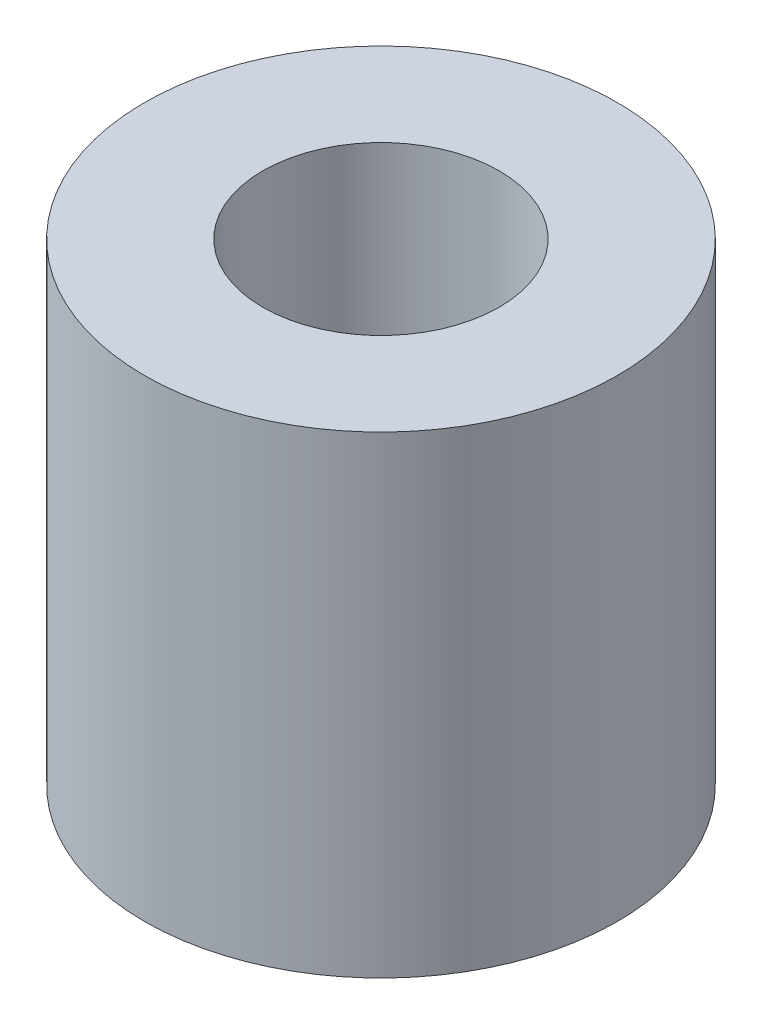
ISO-10303-21;
HEADER;
FILE_DESCRIPTION(('STEP AP214'),'2;1');
FILE_NAME('part.step','',(''),(''),'','','');
FILE_SCHEMA(('AUTOMOTIVE_DESIGN { 1 0 10303 214 1 1 1 1 }'));
ENDSEC;
DATA;
#1=APPLICATION_CONTEXT('core data for automotive mechanical design processes');
#2=APPLICATION_PROTOCOL_DEFINITION('international standard','automotive_design',2000,#1);
#3=PRODUCT_CONTEXT('',#1,'mechanical');
#4=PRODUCT('Part','Part','',(#3));
#5=PRODUCT_RELATED_PRODUCT_CATEGORY('part','',(#4));
#6=PRODUCT_DEFINITION_FORMATION('','',#4);
#7=PRODUCT_DEFINITION_CONTEXT('part definition',#1,'design');
#8=PRODUCT_DEFINITION('design','',#6,#7);
#9=PRODUCT_DEFINITION_SHAPE('','',#8);
#10=(LENGTH_UNIT() NAMED_UNIT(*) SI_UNIT(.MILLI.,.METRE.));
#11=(NAMED_UNIT(*) PLANE_ANGLE_UNIT() SI_UNIT($,.RADIAN.));
#12=(NAMED_UNIT(*) SI_UNIT($,.STERADIAN.) SOLID_ANGLE_UNIT());
#13=UNCERTAINTY_MEASURE_WITH_UNIT(LENGTH_MEASURE(1.E-05),#10,'distance_accuracy_value','');
#14=(GEOMETRIC_REPRESENTATION_CONTEXT(3) GLOBAL_UNCERTAINTY_ASSIGNED_CONTEXT((#13)) GLOBAL_UNIT_ASSIGNED_CONTEXT((#10,
#11,#12)) REPRESENTATION_CONTEXT('',''));
#15=CARTESIAN_POINT('',(0.,0.,0.));
#16=DIRECTION('',(0.,0.,1.));
#17=DIRECTION('',(1.,0.,0.));
#18=AXIS2_PLACEMENT_3D('',#15,#16,#17);
#19=CARTESIAN_POINT('',(0.,2.,0.));
#20=DIRECTION('',(0.,1.,0.));
#21=DIRECTION('',(0.,0.,1.));
#22=AXIS2_PLACEMENT_3D('',#19,#20,#21);
#23=PLANE('',#22);
#24=CARTESIAN_POINT('',(0.,2.,0.));
#25=DIRECTION('',(0.,1.,0.));
#26=DIRECTION('',(0.,0.,1.));
#27=AXIS2_PLACEMENT_3D('',#24,#25,#26);
#28=CIRCLE('',#27,1.);
#29=CARTESIAN_POINT('',(0.,2.,1.));
#30=VERTEX_POINT('',#29);
#31=EDGE_CURVE('E10',#30,#30,#28,.T.);
#32=ORIENTED_EDGE('',*,*,#31,.T.);
#33=EDGE_LOOP('',(#32));
#34=FACE_BOUND('',#33,.T.);
#35=CARTESIAN_POINT('',(0.,2.,0.));
#36=DIRECTION('',(0.,1.,0.));
#37=DIRECTION('',(0.,0.,1.));
#38=AXIS2_PLACEMENT_3D('',#35,#36,#37);
#39=CIRCLE('',#38,0.5);
#40=CARTESIAN_POINT('',(0.,2.,0.5));
#41=VERTEX_POINT('',#40);
#42=EDGE_CURVE('E56',#41,#41,#39,.T.);
#43=ORIENTED_EDGE('',*,*,#42,.F.);
#44=EDGE_LOOP('',(#43));
#45=FACE_BOUND('',#44,.T.);
#46=ADVANCED_FACE('F43',(#34,#45),#23,.T.);
#47=CARTESIAN_POINT('',(0.,0.,0.));
#48=DIRECTION('',(0.,1.,0.));
#49=DIRECTION('',(0.,0.,1.));
#50=AXIS2_PLACEMENT_3D('',#47,#48,#49);
#51=PLANE('',#50);
#52=CARTESIAN_POINT('',(0.,0.,0.));
#53=DIRECTION('',(0.,1.,0.));
#54=DIRECTION('',(0.,0.,1.));
#55=AXIS2_PLACEMENT_3D('',#52,#53,#54);
#56=CIRCLE('',#55,1.);
#57=CARTESIAN_POINT('',(0.,0.,1.));
#58=VERTEX_POINT('',#57);
#59=EDGE_CURVE('E47',#58,#58,#56,.T.);
#60=ORIENTED_EDGE('',*,*,#59,.F.);
#61=EDGE_LOOP('',(#60));
#62=FACE_BOUND('',#61,.T.);
#63=CARTESIAN_POINT('',(0.,0.,0.));
#64=DIRECTION('',(0.,1.,0.));
#65=DIRECTION('',(0.,0.,1.));
#66=AXIS2_PLACEMENT_3D('',#63,#64,#65);
#67=CIRCLE('',#66,0.5);
#68=CARTESIAN_POINT('',(0.,0.,0.5));
#69=VERTEX_POINT('',#68);
#70=EDGE_CURVE('E58',#69,#69,#67,.T.);
#71=ORIENTED_EDGE('',*,*,#70,.T.);
#72=EDGE_LOOP('',(#71));
#73=FACE_BOUND('',#72,.T.);
#74=ADVANCED_FACE('F70',(#62,#73),#51,.F.);
#75=CARTESIAN_POINT('',(0.,2.,0.));
#76=DIRECTION('',(0.,-1.,0.));
#77=DIRECTION('',(0.,0.,-1.));
#78=AXIS2_PLACEMENT_3D('',#75,#76,#77);
#79=CYLINDRICAL_SURFACE('',#78,1.);
#80=ORIENTED_EDGE('',*,*,#31,.F.);
#81=EDGE_LOOP('',(#80));
#82=FACE_BOUND('',#81,.T.);
#83=ORIENTED_EDGE('',*,*,#59,.T.);
#84=EDGE_LOOP('',(#83));
#85=FACE_BOUND('',#84,.T.);
#86=ADVANCED_FACE('F45',(#82,#85),#79,.T.);
#87=CARTESIAN_POINT('',(0.,2.,0.));
#88=DIRECTION('',(0.,-1.,0.));
#89=DIRECTION('',(0.,0.,-1.));
#90=AXIS2_PLACEMENT_3D('',#87,#88,#89);
#91=CYLINDRICAL_SURFACE('',#90,0.5);
#92=ORIENTED_EDGE('',*,*,#42,.T.);
#93=EDGE_LOOP('',(#92));
#94=FACE_BOUND('',#93,.T.);
#95=ORIENTED_EDGE('',*,*,#70,.F.);
#96=EDGE_LOOP('',(#95));
#97=FACE_BOUND('',#96,.T.);
#98=ADVANCED_FACE('F66',(#94,#97),#91,.F.);
#99=CLOSED_SHELL('',(#46,#74,#86,#98));
#100=MANIFOLD_SOLID_BREP('B2',#99);
#101=ADVANCED_BREP_SHAPE_REPRESENTATION('',(#18,#100),#14);
#102=SHAPE_DEFINITION_REPRESENTATION(#9,#101);
ENDSEC;
END-ISO-10303-21;
